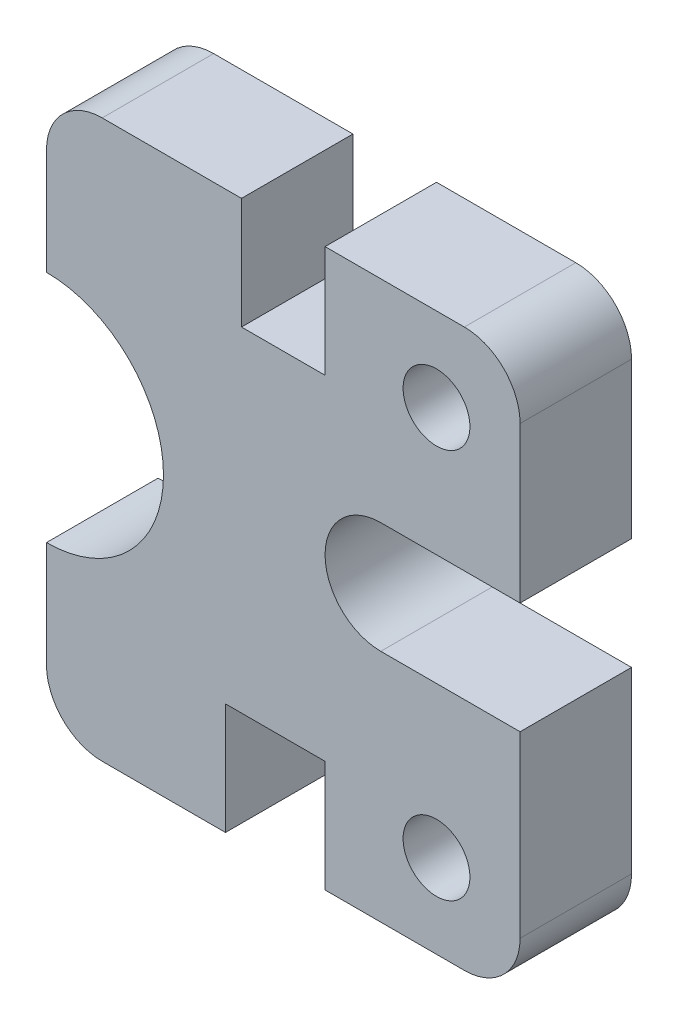
ISO-10303-21;
HEADER;
FILE_DESCRIPTION(('STEP AP214'),'2;1');
FILE_NAME('part.step','',(''),(''),'','','');
FILE_SCHEMA(('AUTOMOTIVE_DESIGN { 1 0 10303 214 1 1 1 1 }'));
ENDSEC;
DATA;
#1=APPLICATION_CONTEXT('core data for automotive mechanical design processes');
#2=APPLICATION_PROTOCOL_DEFINITION('international standard','automotive_design',2000,#1);
#3=PRODUCT_CONTEXT('',#1,'mechanical');
#4=PRODUCT('Part','Part','',(#3));
#5=PRODUCT_RELATED_PRODUCT_CATEGORY('part','',(#4));
#6=PRODUCT_DEFINITION_FORMATION('','',#4);
#7=PRODUCT_DEFINITION_CONTEXT('part definition',#1,'design');
#8=PRODUCT_DEFINITION('design','',#6,#7);
#9=PRODUCT_DEFINITION_SHAPE('','',#8);
#10=(LENGTH_UNIT() NAMED_UNIT(*) SI_UNIT(.MILLI.,.METRE.));
#11=(NAMED_UNIT(*) PLANE_ANGLE_UNIT() SI_UNIT($,.RADIAN.));
#12=(NAMED_UNIT(*) SI_UNIT($,.STERADIAN.) SOLID_ANGLE_UNIT());
#13=UNCERTAINTY_MEASURE_WITH_UNIT(LENGTH_MEASURE(1.E-05),#10,'distance_accuracy_value','');
#14=(GEOMETRIC_REPRESENTATION_CONTEXT(3) GLOBAL_UNCERTAINTY_ASSIGNED_CONTEXT((#13)) GLOBAL_UNIT_ASSIGNED_CONTEXT((#10,
#11,#12)) REPRESENTATION_CONTEXT('',''));
#15=CARTESIAN_POINT('',(0.,0.,0.));
#16=DIRECTION('',(0.,0.,1.));
#17=DIRECTION('',(1.,0.,0.));
#18=AXIS2_PLACEMENT_3D('',#15,#16,#17);
#19=CARTESIAN_POINT('',(32.5,40.,20.));
#20=DIRECTION('',(0.,0.,1.));
#21=DIRECTION('',(1.,0.,0.));
#22=AXIS2_PLACEMENT_3D('',#19,#20,#21);
#23=PLANE('',#22);
#24=CARTESIAN_POINT('',(27.5,35.,20.));
#25=DIRECTION('',(0.,0.,1.));
#26=DIRECTION('',(1.,0.,0.));
#27=AXIS2_PLACEMENT_3D('',#24,#25,#26);
#28=CIRCLE('',#27,6.);
#29=CARTESIAN_POINT('',(33.5,35.,20.));
#30=VERTEX_POINT('',#29);
#31=EDGE_CURVE('E218',#30,#30,#28,.T.);
#32=ORIENTED_EDGE('',*,*,#31,.F.);
#33=EDGE_LOOP('',(#32));
#34=FACE_BOUND('',#33,.T.);
#35=DIRECTION('',(-1.,0.,0.));
#36=VECTOR('',#35,1.);
#37=CARTESIAN_POINT('',(-32.4999999999999,50.,20.));
#38=LINE('',#37,#36);
#39=CARTESIAN_POINT('',(-7.5,50.,20.));
#40=VERTEX_POINT('',#39);
#41=CARTESIAN_POINT('',(-32.4999999999999,50.,20.));
#42=VERTEX_POINT('',#41);
#43=EDGE_CURVE('E257',#40,#42,#38,.T.);
#44=ORIENTED_EDGE('',*,*,#43,.T.);
#45=CARTESIAN_POINT('',(-32.5,40.,20.));
#46=DIRECTION('',(0.,0.,1.));
#47=DIRECTION('',(-1.,0.,0.));
#48=AXIS2_PLACEMENT_3D('',#45,#46,#47);
#49=CIRCLE('',#48,10.);
#50=CARTESIAN_POINT('',(-42.5,39.9999999999999,20.));
#51=VERTEX_POINT('',#50);
#52=EDGE_CURVE('E135',#42,#51,#49,.T.);
#53=ORIENTED_EDGE('',*,*,#52,.T.);
#54=DIRECTION('',(0.,-1.,0.));
#55=VECTOR('',#54,1.);
#56=CARTESIAN_POINT('',(-42.5,21.,20.));
#57=LINE('',#56,#55);
#58=CARTESIAN_POINT('',(-42.5,21.,20.));
#59=VERTEX_POINT('',#58);
#60=EDGE_CURVE('E314',#51,#59,#57,.T.);
#61=ORIENTED_EDGE('',*,*,#60,.T.);
#62=CARTESIAN_POINT('',(-42.5,0.,20.));
#63=DIRECTION('',(0.,0.,-1.));
#64=DIRECTION('',(1.,0.,0.));
#65=AXIS2_PLACEMENT_3D('',#62,#63,#64);
#66=CIRCLE('',#65,21.);
#67=CARTESIAN_POINT('',(-42.5,-21.,20.));
#68=VERTEX_POINT('',#67);
#69=EDGE_CURVE('E333',#59,#68,#66,.T.);
#70=ORIENTED_EDGE('',*,*,#69,.T.);
#71=DIRECTION('',(0.,-1.,0.));
#72=VECTOR('',#71,1.);
#73=CARTESIAN_POINT('',(-42.5,-39.9999999999999,20.));
#74=LINE('',#73,#72);
#75=CARTESIAN_POINT('',(-42.5,-40.,20.));
#76=VERTEX_POINT('',#75);
#77=EDGE_CURVE('E330',#68,#76,#74,.T.);
#78=ORIENTED_EDGE('',*,*,#77,.T.);
#79=CARTESIAN_POINT('',(-32.5,-40.,20.));
#80=DIRECTION('',(0.,0.,1.));
#81=DIRECTION('',(-1.,0.,0.));
#82=AXIS2_PLACEMENT_3D('',#79,#80,#81);
#83=CIRCLE('',#82,10.);
#84=CARTESIAN_POINT('',(-32.4999999999999,-50.,20.));
#85=VERTEX_POINT('',#84);
#86=EDGE_CURVE('E332',#76,#85,#83,.T.);
#87=ORIENTED_EDGE('',*,*,#86,.T.);
#88=DIRECTION('',(1.,0.,0.));
#89=VECTOR('',#88,1.);
#90=CARTESIAN_POINT('',(-32.4999999999999,-50.,20.));
#91=LINE('',#90,#89);
#92=CARTESIAN_POINT('',(-10.3726091663659,-50.,20.));
#93=VERTEX_POINT('',#92);
#94=EDGE_CURVE('E335',#85,#93,#91,.T.);
#95=ORIENTED_EDGE('',*,*,#94,.T.);
#96=DIRECTION('',(0.,1.,0.));
#97=VECTOR('',#96,1.);
#98=CARTESIAN_POINT('',(-10.3726091663659,-30.,20.));
#99=LINE('',#98,#97);
#100=CARTESIAN_POINT('',(-10.3726091663659,-30.,20.));
#101=VERTEX_POINT('',#100);
#102=EDGE_CURVE('E341',#93,#101,#99,.T.);
#103=ORIENTED_EDGE('',*,*,#102,.T.);
#104=DIRECTION('',(1.,0.,0.));
#105=VECTOR('',#104,1.);
#106=CARTESIAN_POINT('',(7.49999999999999,-30.,20.));
#107=LINE('',#106,#105);
#108=CARTESIAN_POINT('',(7.49999999999999,-30.,20.));
#109=VERTEX_POINT('',#108);
#110=EDGE_CURVE('E343',#101,#109,#107,.T.);
#111=ORIENTED_EDGE('',*,*,#110,.T.);
#112=DIRECTION('',(0.,-1.,0.));
#113=VECTOR('',#112,1.);
#114=CARTESIAN_POINT('',(7.5,-50.,20.));
#115=LINE('',#114,#113);
#116=CARTESIAN_POINT('',(7.5,-50.,20.));
#117=VERTEX_POINT('',#116);
#118=EDGE_CURVE('E345',#109,#117,#115,.T.);
#119=ORIENTED_EDGE('',*,*,#118,.T.);
#120=DIRECTION('',(1.,0.,0.));
#121=VECTOR('',#120,1.);
#122=CARTESIAN_POINT('',(7.5,-50.,20.));
#123=LINE('',#122,#121);
#124=CARTESIAN_POINT('',(32.4999999999999,-50.,20.));
#125=VERTEX_POINT('',#124);
#126=EDGE_CURVE('E347',#117,#125,#123,.T.);
#127=ORIENTED_EDGE('',*,*,#126,.T.);
#128=CARTESIAN_POINT('',(32.5,-40.,20.));
#129=DIRECTION('',(0.,0.,1.));
#130=DIRECTION('',(-1.,0.,0.));
#131=AXIS2_PLACEMENT_3D('',#128,#129,#130);
#132=CIRCLE('',#131,10.);
#133=CARTESIAN_POINT('',(42.5,-39.9999999999999,20.));
#134=VERTEX_POINT('',#133);
#135=EDGE_CURVE('E349',#125,#134,#132,.T.);
#136=ORIENTED_EDGE('',*,*,#135,.T.);
#137=DIRECTION('',(0.,1.,0.));
#138=VECTOR('',#137,1.);
#139=CARTESIAN_POINT('',(42.5,-39.9999999999999,20.));
#140=LINE('',#139,#138);
#141=CARTESIAN_POINT('',(42.5,-7.90215626127752,20.));
#142=VERTEX_POINT('',#141);
#143=EDGE_CURVE('E351',#134,#142,#140,.T.);
#144=ORIENTED_EDGE('',*,*,#143,.T.);
#145=DIRECTION('',(-1.,0.,0.));
#146=VECTOR('',#145,1.);
#147=CARTESIAN_POINT('',(17.5,-7.90215626127752,20.));
#148=LINE('',#147,#146);
#149=CARTESIAN_POINT('',(17.5,-7.90215626127752,20.));
#150=VERTEX_POINT('',#149);
#151=EDGE_CURVE('E353',#142,#150,#148,.T.);
#152=ORIENTED_EDGE('',*,*,#151,.T.);
#153=CARTESIAN_POINT('',(17.5,2.09784373872248,20.));
#154=DIRECTION('',(0.,0.,-1.));
#155=DIRECTION('',(1.,0.,0.));
#156=AXIS2_PLACEMENT_3D('',#153,#154,#155);
#157=CIRCLE('',#156,10.);
#158=CARTESIAN_POINT('',(17.5,12.0978437387225,20.));
#159=VERTEX_POINT('',#158);
#160=EDGE_CURVE('E355',#150,#159,#157,.T.);
#161=ORIENTED_EDGE('',*,*,#160,.T.);
#162=DIRECTION('',(1.,0.,0.));
#163=VECTOR('',#162,1.);
#164=CARTESIAN_POINT('',(42.5,12.0978437387225,20.));
#165=LINE('',#164,#163);
#166=CARTESIAN_POINT('',(42.5,12.0978437387225,20.));
#167=VERTEX_POINT('',#166);
#168=EDGE_CURVE('E357',#159,#167,#165,.T.);
#169=ORIENTED_EDGE('',*,*,#168,.T.);
#170=DIRECTION('',(0.,1.,0.));
#171=VECTOR('',#170,1.);
#172=CARTESIAN_POINT('',(42.5,12.0978437387225,20.));
#173=LINE('',#172,#171);
#174=CARTESIAN_POINT('',(42.5,39.9999999999999,20.));
#175=VERTEX_POINT('',#174);
#176=EDGE_CURVE('E359',#167,#175,#173,.T.);
#177=ORIENTED_EDGE('',*,*,#176,.T.);
#178=CARTESIAN_POINT('',(32.5,40.,20.));
#179=DIRECTION('',(0.,0.,1.));
#180=DIRECTION('',(1.,0.,0.));
#181=AXIS2_PLACEMENT_3D('',#178,#179,#180);
#182=CIRCLE('',#181,10.);
#183=CARTESIAN_POINT('',(32.4999999999999,50.,20.));
#184=VERTEX_POINT('',#183);
#185=EDGE_CURVE('E361',#175,#184,#182,.T.);
#186=ORIENTED_EDGE('',*,*,#185,.T.);
#187=DIRECTION('',(-1.,0.,0.));
#188=VECTOR('',#187,1.);
#189=CARTESIAN_POINT('',(7.5,50.,20.));
#190=LINE('',#189,#188);
#191=CARTESIAN_POINT('',(7.5,50.,20.));
#192=VERTEX_POINT('',#191);
#193=EDGE_CURVE('E196',#184,#192,#190,.T.);
#194=ORIENTED_EDGE('',*,*,#193,.T.);
#195=DIRECTION('',(0.,-1.,0.));
#196=VECTOR('',#195,1.);
#197=CARTESIAN_POINT('',(7.49999999999999,30.,20.));
#198=LINE('',#197,#196);
#199=CARTESIAN_POINT('',(7.49999999999999,30.,20.));
#200=VERTEX_POINT('',#199);
#201=EDGE_CURVE('E190',#192,#200,#198,.T.);
#202=ORIENTED_EDGE('',*,*,#201,.T.);
#203=DIRECTION('',(-1.,0.,0.));
#204=VECTOR('',#203,1.);
#205=CARTESIAN_POINT('',(-7.50000000000001,30.,20.));
#206=LINE('',#205,#204);
#207=CARTESIAN_POINT('',(-7.50000000000001,30.,20.));
#208=VERTEX_POINT('',#207);
#209=EDGE_CURVE('E194',#200,#208,#206,.T.);
#210=ORIENTED_EDGE('',*,*,#209,.T.);
#211=DIRECTION('',(0.,1.,0.));
#212=VECTOR('',#211,1.);
#213=CARTESIAN_POINT('',(-7.5,50.,20.));
#214=LINE('',#213,#212);
#215=EDGE_CURVE('E50',#208,#40,#214,.T.);
#216=ORIENTED_EDGE('',*,*,#215,.T.);
#217=EDGE_LOOP('',(#44,#53,#61,#70,#78,#87,#95,#103,#111,#119,#127,#136,#144,#152,#161,#169,
#177,#186,#194,#202,#210,#216));
#218=FACE_BOUND('',#217,.T.);
#219=CARTESIAN_POINT('',(27.5,-35.,20.));
#220=DIRECTION('',(0.,0.,1.));
#221=DIRECTION('',(1.,0.,0.));
#222=AXIS2_PLACEMENT_3D('',#219,#220,#221);
#223=CIRCLE('',#222,5.99999999999999);
#224=CARTESIAN_POINT('',(33.5,-35.,20.));
#225=VERTEX_POINT('',#224);
#226=EDGE_CURVE('E403',#225,#225,#223,.T.);
#227=ORIENTED_EDGE('',*,*,#226,.F.);
#228=EDGE_LOOP('',(#227));
#229=FACE_BOUND('',#228,.T.);
#230=ADVANCED_FACE('F33',(#34,#218,#229),#23,.T.);
#231=CARTESIAN_POINT('',(32.5,40.,0.));
#232=DIRECTION('',(0.,0.,1.));
#233=DIRECTION('',(1.,0.,0.));
#234=AXIS2_PLACEMENT_3D('',#231,#232,#233);
#235=PLANE('',#234);
#236=DIRECTION('',(-1.,0.,0.));
#237=VECTOR('',#236,1.);
#238=CARTESIAN_POINT('',(-32.4999999999999,50.,0.));
#239=LINE('',#238,#237);
#240=CARTESIAN_POINT('',(-7.5,50.,0.));
#241=VERTEX_POINT('',#240);
#242=CARTESIAN_POINT('',(-32.4999999999999,50.,0.));
#243=VERTEX_POINT('',#242);
#244=EDGE_CURVE('E214',#241,#243,#239,.T.);
#245=ORIENTED_EDGE('',*,*,#244,.F.);
#246=DIRECTION('',(0.,1.,0.));
#247=VECTOR('',#246,1.);
#248=CARTESIAN_POINT('',(-7.5,50.,0.));
#249=LINE('',#248,#247);
#250=CARTESIAN_POINT('',(-7.50000000000001,30.,0.));
#251=VERTEX_POINT('',#250);
#252=EDGE_CURVE('E127',#251,#241,#249,.T.);
#253=ORIENTED_EDGE('',*,*,#252,.F.);
#254=DIRECTION('',(-1.,0.,0.));
#255=VECTOR('',#254,1.);
#256=CARTESIAN_POINT('',(-7.50000000000001,30.,0.));
#257=LINE('',#256,#255);
#258=CARTESIAN_POINT('',(7.49999999999999,30.,0.));
#259=VERTEX_POINT('',#258);
#260=EDGE_CURVE('E121',#259,#251,#257,.T.);
#261=ORIENTED_EDGE('',*,*,#260,.F.);
#262=DIRECTION('',(0.,-1.,0.));
#263=VECTOR('',#262,1.);
#264=CARTESIAN_POINT('',(7.49999999999999,30.,0.));
#265=LINE('',#264,#263);
#266=CARTESIAN_POINT('',(7.5,50.,0.));
#267=VERTEX_POINT('',#266);
#268=EDGE_CURVE('E204',#267,#259,#265,.T.);
#269=ORIENTED_EDGE('',*,*,#268,.F.);
#270=DIRECTION('',(-1.,0.,0.));
#271=VECTOR('',#270,1.);
#272=CARTESIAN_POINT('',(7.5,50.,0.));
#273=LINE('',#272,#271);
#274=CARTESIAN_POINT('',(32.4999999999999,50.,0.));
#275=VERTEX_POINT('',#274);
#276=EDGE_CURVE('E252',#275,#267,#273,.T.);
#277=ORIENTED_EDGE('',*,*,#276,.F.);
#278=CARTESIAN_POINT('',(32.5,40.,0.));
#279=DIRECTION('',(0.,0.,1.));
#280=DIRECTION('',(1.,0.,0.));
#281=AXIS2_PLACEMENT_3D('',#278,#279,#280);
#282=CIRCLE('',#281,10.);
#283=CARTESIAN_POINT('',(42.5,39.9999999999999,0.));
#284=VERTEX_POINT('',#283);
#285=EDGE_CURVE('E250',#284,#275,#282,.T.);
#286=ORIENTED_EDGE('',*,*,#285,.F.);
#287=DIRECTION('',(0.,1.,0.));
#288=VECTOR('',#287,1.);
#289=CARTESIAN_POINT('',(42.5,12.0978437387225,0.));
#290=LINE('',#289,#288);
#291=CARTESIAN_POINT('',(42.5,12.0978437387225,0.));
#292=VERTEX_POINT('',#291);
#293=EDGE_CURVE('E248',#292,#284,#290,.T.);
#294=ORIENTED_EDGE('',*,*,#293,.F.);
#295=DIRECTION('',(1.,0.,0.));
#296=VECTOR('',#295,1.);
#297=CARTESIAN_POINT('',(42.5,12.0978437387225,0.));
#298=LINE('',#297,#296);
#299=CARTESIAN_POINT('',(17.5,12.0978437387225,0.));
#300=VERTEX_POINT('',#299);
#301=EDGE_CURVE('E246',#300,#292,#298,.T.);
#302=ORIENTED_EDGE('',*,*,#301,.F.);
#303=CARTESIAN_POINT('',(17.5,2.09784373872248,0.));
#304=DIRECTION('',(0.,0.,-1.));
#305=DIRECTION('',(1.,0.,0.));
#306=AXIS2_PLACEMENT_3D('',#303,#304,#305);
#307=CIRCLE('',#306,10.);
#308=CARTESIAN_POINT('',(17.5,-7.90215626127752,0.));
#309=VERTEX_POINT('',#308);
#310=EDGE_CURVE('E244',#309,#300,#307,.T.);
#311=ORIENTED_EDGE('',*,*,#310,.F.);
#312=DIRECTION('',(-1.,0.,0.));
#313=VECTOR('',#312,1.);
#314=CARTESIAN_POINT('',(17.5,-7.90215626127752,0.));
#315=LINE('',#314,#313);
#316=CARTESIAN_POINT('',(42.5,-7.90215626127752,0.));
#317=VERTEX_POINT('',#316);
#318=EDGE_CURVE('E242',#317,#309,#315,.T.);
#319=ORIENTED_EDGE('',*,*,#318,.F.);
#320=DIRECTION('',(0.,1.,0.));
#321=VECTOR('',#320,1.);
#322=CARTESIAN_POINT('',(42.5,-39.9999999999999,0.));
#323=LINE('',#322,#321);
#324=CARTESIAN_POINT('',(42.5,-39.9999999999999,0.));
#325=VERTEX_POINT('',#324);
#326=EDGE_CURVE('E240',#325,#317,#323,.T.);
#327=ORIENTED_EDGE('',*,*,#326,.F.);
#328=CARTESIAN_POINT('',(32.5,-40.,0.));
#329=DIRECTION('',(0.,0.,1.));
#330=DIRECTION('',(-1.,0.,0.));
#331=AXIS2_PLACEMENT_3D('',#328,#329,#330);
#332=CIRCLE('',#331,10.);
#333=CARTESIAN_POINT('',(32.4999999999999,-50.,0.));
#334=VERTEX_POINT('',#333);
#335=EDGE_CURVE('E238',#334,#325,#332,.T.);
#336=ORIENTED_EDGE('',*,*,#335,.F.);
#337=DIRECTION('',(1.,0.,0.));
#338=VECTOR('',#337,1.);
#339=CARTESIAN_POINT('',(7.5,-50.,0.));
#340=LINE('',#339,#338);
#341=CARTESIAN_POINT('',(7.5,-50.,0.));
#342=VERTEX_POINT('',#341);
#343=EDGE_CURVE('E236',#342,#334,#340,.T.);
#344=ORIENTED_EDGE('',*,*,#343,.F.);
#345=DIRECTION('',(0.,-1.,0.));
#346=VECTOR('',#345,1.);
#347=CARTESIAN_POINT('',(7.5,-50.,0.));
#348=LINE('',#347,#346);
#349=CARTESIAN_POINT('',(7.49999999999999,-30.,0.));
#350=VERTEX_POINT('',#349);
#351=EDGE_CURVE('E234',#350,#342,#348,.T.);
#352=ORIENTED_EDGE('',*,*,#351,.F.);
#353=DIRECTION('',(1.,0.,0.));
#354=VECTOR('',#353,1.);
#355=CARTESIAN_POINT('',(7.49999999999999,-30.,0.));
#356=LINE('',#355,#354);
#357=CARTESIAN_POINT('',(-10.3726091663659,-30.,0.));
#358=VERTEX_POINT('',#357);
#359=EDGE_CURVE('E232',#358,#350,#356,.T.);
#360=ORIENTED_EDGE('',*,*,#359,.F.);
#361=DIRECTION('',(0.,1.,0.));
#362=VECTOR('',#361,1.);
#363=CARTESIAN_POINT('',(-10.3726091663659,-30.,0.));
#364=LINE('',#363,#362);
#365=CARTESIAN_POINT('',(-10.3726091663659,-50.,0.));
#366=VERTEX_POINT('',#365);
#367=EDGE_CURVE('E230',#366,#358,#364,.T.);
#368=ORIENTED_EDGE('',*,*,#367,.F.);
#369=DIRECTION('',(1.,0.,0.));
#370=VECTOR('',#369,1.);
#371=CARTESIAN_POINT('',(-32.4999999999999,-50.,0.));
#372=LINE('',#371,#370);
#373=CARTESIAN_POINT('',(-32.4999999999999,-50.,0.));
#374=VERTEX_POINT('',#373);
#375=EDGE_CURVE('E228',#374,#366,#372,.T.);
#376=ORIENTED_EDGE('',*,*,#375,.F.);
#377=CARTESIAN_POINT('',(-32.5,-40.,0.));
#378=DIRECTION('',(0.,0.,1.));
#379=DIRECTION('',(-1.,0.,0.));
#380=AXIS2_PLACEMENT_3D('',#377,#378,#379);
#381=CIRCLE('',#380,10.);
#382=CARTESIAN_POINT('',(-42.5,-40.,0.));
#383=VERTEX_POINT('',#382);
#384=EDGE_CURVE('E226',#383,#374,#381,.T.);
#385=ORIENTED_EDGE('',*,*,#384,.F.);
#386=DIRECTION('',(0.,-1.,0.));
#387=VECTOR('',#386,1.);
#388=CARTESIAN_POINT('',(-42.5,-39.9999999999999,0.));
#389=LINE('',#388,#387);
#390=CARTESIAN_POINT('',(-42.5,-21.,0.));
#391=VERTEX_POINT('',#390);
#392=EDGE_CURVE('E224',#391,#383,#389,.T.);
#393=ORIENTED_EDGE('',*,*,#392,.F.);
#394=CARTESIAN_POINT('',(-42.5,0.,0.));
#395=DIRECTION('',(0.,0.,-1.));
#396=DIRECTION('',(1.,0.,0.));
#397=AXIS2_PLACEMENT_3D('',#394,#395,#396);
#398=CIRCLE('',#397,21.);
#399=CARTESIAN_POINT('',(-42.5,21.,0.));
#400=VERTEX_POINT('',#399);
#401=EDGE_CURVE('E222',#400,#391,#398,.T.);
#402=ORIENTED_EDGE('',*,*,#401,.F.);
#403=DIRECTION('',(0.,-1.,0.));
#404=VECTOR('',#403,1.);
#405=CARTESIAN_POINT('',(-42.5,21.,0.));
#406=LINE('',#405,#404);
#407=CARTESIAN_POINT('',(-42.5,39.9999999999999,0.));
#408=VERTEX_POINT('',#407);
#409=EDGE_CURVE('E220',#408,#400,#406,.T.);
#410=ORIENTED_EDGE('',*,*,#409,.F.);
#411=CARTESIAN_POINT('',(-32.5,40.,0.));
#412=DIRECTION('',(0.,0.,1.));
#413=DIRECTION('',(-1.,0.,0.));
#414=AXIS2_PLACEMENT_3D('',#411,#412,#413);
#415=CIRCLE('',#414,10.);
#416=EDGE_CURVE('E217',#243,#408,#415,.T.);
#417=ORIENTED_EDGE('',*,*,#416,.F.);
#418=EDGE_LOOP('',(#245,#253,#261,#269,#277,#286,#294,#302,#311,#319,#327,#336,#344,#352,#360,
#368,#376,#385,#393,#402,#410,#417));
#419=FACE_BOUND('',#418,.T.);
#420=CARTESIAN_POINT('',(27.5,35.,0.));
#421=DIRECTION('',(0.,0.,1.));
#422=DIRECTION('',(1.,0.,0.));
#423=AXIS2_PLACEMENT_3D('',#420,#421,#422);
#424=CIRCLE('',#423,6.);
#425=CARTESIAN_POINT('',(33.5,35.,0.));
#426=VERTEX_POINT('',#425);
#427=EDGE_CURVE('E409',#426,#426,#424,.T.);
#428=ORIENTED_EDGE('',*,*,#427,.T.);
#429=EDGE_LOOP('',(#428));
#430=FACE_BOUND('',#429,.T.);
#431=CARTESIAN_POINT('',(27.5,-35.,0.));
#432=DIRECTION('',(0.,0.,1.));
#433=DIRECTION('',(1.,0.,0.));
#434=AXIS2_PLACEMENT_3D('',#431,#432,#433);
#435=CIRCLE('',#434,5.99999999999999);
#436=CARTESIAN_POINT('',(33.5,-35.,0.));
#437=VERTEX_POINT('',#436);
#438=EDGE_CURVE('E406',#437,#437,#435,.T.);
#439=ORIENTED_EDGE('',*,*,#438,.T.);
#440=EDGE_LOOP('',(#439));
#441=FACE_BOUND('',#440,.T.);
#442=ADVANCED_FACE('F318',(#419,#430,#441),#235,.F.);
#443=CARTESIAN_POINT('',(-32.4999999999999,50.,20.));
#444=DIRECTION('',(0.,-1.,0.));
#445=DIRECTION('',(1.,0.,0.));
#446=AXIS2_PLACEMENT_3D('',#443,#444,#445);
#447=PLANE('',#446);
#448=ORIENTED_EDGE('',*,*,#244,.T.);
#449=DIRECTION('',(0.,0.,-1.));
#450=VECTOR('',#449,1.);
#451=CARTESIAN_POINT('',(-32.4999999999999,50.,20.));
#452=LINE('',#451,#450);
#453=EDGE_CURVE('E11',#42,#243,#452,.T.);
#454=ORIENTED_EDGE('',*,*,#453,.F.);
#455=ORIENTED_EDGE('',*,*,#43,.F.);
#456=DIRECTION('',(0.,0.,-1.));
#457=VECTOR('',#456,1.);
#458=CARTESIAN_POINT('',(-7.5,50.,20.));
#459=LINE('',#458,#457);
#460=EDGE_CURVE('E210',#40,#241,#459,.T.);
#461=ORIENTED_EDGE('',*,*,#460,.T.);
#462=EDGE_LOOP('',(#448,#454,#455,#461));
#463=FACE_BOUND('',#462,.T.);
#464=ADVANCED_FACE('F35',(#463),#447,.F.);
#465=CARTESIAN_POINT('',(-32.5,40.,20.));
#466=DIRECTION('',(0.,0.,-1.));
#467=DIRECTION('',(-1.,0.,0.));
#468=AXIS2_PLACEMENT_3D('',#465,#466,#467);
#469=CYLINDRICAL_SURFACE('',#468,10.);
#470=ORIENTED_EDGE('',*,*,#416,.T.);
#471=DIRECTION('',(0.,0.,-1.));
#472=VECTOR('',#471,1.);
#473=CARTESIAN_POINT('',(-42.5,39.9999999999999,20.));
#474=LINE('',#473,#472);
#475=EDGE_CURVE('E42',#51,#408,#474,.T.);
#476=ORIENTED_EDGE('',*,*,#475,.F.);
#477=ORIENTED_EDGE('',*,*,#52,.F.);
#478=ORIENTED_EDGE('',*,*,#453,.T.);
#479=EDGE_LOOP('',(#470,#476,#477,#478));
#480=FACE_BOUND('',#479,.T.);
#481=ADVANCED_FACE('F602',(#480),#469,.T.);
#482=CARTESIAN_POINT('',(-42.5,21.,20.));
#483=DIRECTION('',(1.,0.,0.));
#484=DIRECTION('',(0.,0.,-1.));
#485=AXIS2_PLACEMENT_3D('',#482,#483,#484);
#486=PLANE('',#485);
#487=ORIENTED_EDGE('',*,*,#409,.T.);
#488=DIRECTION('',(0.,0.,-1.));
#489=VECTOR('',#488,1.);
#490=CARTESIAN_POINT('',(-42.5,21.,20.));
#491=LINE('',#490,#489);
#492=EDGE_CURVE('E306',#59,#400,#491,.T.);
#493=ORIENTED_EDGE('',*,*,#492,.F.);
#494=ORIENTED_EDGE('',*,*,#60,.F.);
#495=ORIENTED_EDGE('',*,*,#475,.T.);
#496=EDGE_LOOP('',(#487,#493,#494,#495));
#497=FACE_BOUND('',#496,.T.);
#498=ADVANCED_FACE('F312',(#497),#486,.F.);
#499=CARTESIAN_POINT('',(-42.5,0.,20.));
#500=DIRECTION('',(0.,0.,-1.));
#501=DIRECTION('',(-1.,0.,0.));
#502=AXIS2_PLACEMENT_3D('',#499,#500,#501);
#503=CYLINDRICAL_SURFACE('',#502,21.);
#504=ORIENTED_EDGE('',*,*,#401,.T.);
#505=DIRECTION('',(0.,0.,-1.));
#506=VECTOR('',#505,1.);
#507=CARTESIAN_POINT('',(-42.5,-21.,20.));
#508=LINE('',#507,#506);
#509=EDGE_CURVE('E303',#68,#391,#508,.T.);
#510=ORIENTED_EDGE('',*,*,#509,.F.);
#511=ORIENTED_EDGE('',*,*,#69,.F.);
#512=ORIENTED_EDGE('',*,*,#492,.T.);
#513=EDGE_LOOP('',(#504,#510,#511,#512));
#514=FACE_BOUND('',#513,.T.);
#515=ADVANCED_FACE('F324',(#514),#503,.F.);
#516=CARTESIAN_POINT('',(-42.5,-39.9999999999999,20.));
#517=DIRECTION('',(1.,0.,0.));
#518=DIRECTION('',(0.,0.,-1.));
#519=AXIS2_PLACEMENT_3D('',#516,#517,#518);
#520=PLANE('',#519);
#521=ORIENTED_EDGE('',*,*,#392,.T.);
#522=DIRECTION('',(0.,0.,-1.));
#523=VECTOR('',#522,1.);
#524=CARTESIAN_POINT('',(-42.5,-40.,20.));
#525=LINE('',#524,#523);
#526=EDGE_CURVE('E300',#76,#383,#525,.T.);
#527=ORIENTED_EDGE('',*,*,#526,.F.);
#528=ORIENTED_EDGE('',*,*,#77,.F.);
#529=ORIENTED_EDGE('',*,*,#509,.T.);
#530=EDGE_LOOP('',(#521,#527,#528,#529));
#531=FACE_BOUND('',#530,.T.);
#532=ADVANCED_FACE('F328',(#531),#520,.F.);
#533=CARTESIAN_POINT('',(-32.5,-40.,20.));
#534=DIRECTION('',(0.,0.,-1.));
#535=DIRECTION('',(-1.,0.,0.));
#536=AXIS2_PLACEMENT_3D('',#533,#534,#535);
#537=CYLINDRICAL_SURFACE('',#536,10.);
#538=ORIENTED_EDGE('',*,*,#384,.T.);
#539=DIRECTION('',(0.,0.,-1.));
#540=VECTOR('',#539,1.);
#541=CARTESIAN_POINT('',(-32.4999999999999,-50.,20.));
#542=LINE('',#541,#540);
#543=EDGE_CURVE('E297',#85,#374,#542,.T.);
#544=ORIENTED_EDGE('',*,*,#543,.F.);
#545=ORIENTED_EDGE('',*,*,#86,.F.);
#546=ORIENTED_EDGE('',*,*,#526,.T.);
#547=EDGE_LOOP('',(#538,#544,#545,#546));
#548=FACE_BOUND('',#547,.T.);
#549=ADVANCED_FACE('F567',(#548),#537,.T.);
#550=CARTESIAN_POINT('',(-32.4999999999999,-50.,20.));
#551=DIRECTION('',(0.,1.,0.));
#552=DIRECTION('',(0.,0.,1.));
#553=AXIS2_PLACEMENT_3D('',#550,#551,#552);
#554=PLANE('',#553);
#555=ORIENTED_EDGE('',*,*,#375,.T.);
#556=DIRECTION('',(0.,0.,-1.));
#557=VECTOR('',#556,1.);
#558=CARTESIAN_POINT('',(-10.3726091663659,-50.,20.));
#559=LINE('',#558,#557);
#560=EDGE_CURVE('E294',#93,#366,#559,.T.);
#561=ORIENTED_EDGE('',*,*,#560,.F.);
#562=ORIENTED_EDGE('',*,*,#94,.F.);
#563=ORIENTED_EDGE('',*,*,#543,.T.);
#564=EDGE_LOOP('',(#555,#561,#562,#563));
#565=FACE_BOUND('',#564,.T.);
#566=ADVANCED_FACE('F557',(#565),#554,.F.);
#567=CARTESIAN_POINT('',(-10.3726091663659,-30.,20.));
#568=DIRECTION('',(-1.,0.,0.));
#569=DIRECTION('',(0.,-1.,0.));
#570=AXIS2_PLACEMENT_3D('',#567,#568,#569);
#571=PLANE('',#570);
#572=ORIENTED_EDGE('',*,*,#367,.T.);
#573=DIRECTION('',(0.,0.,-1.));
#574=VECTOR('',#573,1.);
#575=CARTESIAN_POINT('',(-10.3726091663659,-30.,20.));
#576=LINE('',#575,#574);
#577=EDGE_CURVE('E291',#101,#358,#576,.T.);
#578=ORIENTED_EDGE('',*,*,#577,.F.);
#579=ORIENTED_EDGE('',*,*,#102,.F.);
#580=ORIENTED_EDGE('',*,*,#560,.T.);
#581=EDGE_LOOP('',(#572,#578,#579,#580));
#582=FACE_BOUND('',#581,.T.);
#583=ADVANCED_FACE('F547',(#582),#571,.F.);
#584=CARTESIAN_POINT('',(7.49999999999999,-30.,20.));
#585=DIRECTION('',(0.,1.,0.));
#586=DIRECTION('',(0.,0.,1.));
#587=AXIS2_PLACEMENT_3D('',#584,#585,#586);
#588=PLANE('',#587);
#589=ORIENTED_EDGE('',*,*,#359,.T.);
#590=DIRECTION('',(0.,0.,-1.));
#591=VECTOR('',#590,1.);
#592=CARTESIAN_POINT('',(7.49999999999999,-30.,20.));
#593=LINE('',#592,#591);
#594=EDGE_CURVE('E288',#109,#350,#593,.T.);
#595=ORIENTED_EDGE('',*,*,#594,.F.);
#596=ORIENTED_EDGE('',*,*,#110,.F.);
#597=ORIENTED_EDGE('',*,*,#577,.T.);
#598=EDGE_LOOP('',(#589,#595,#596,#597));
#599=FACE_BOUND('',#598,.T.);
#600=ADVANCED_FACE('F537',(#599),#588,.F.);
#601=CARTESIAN_POINT('',(7.5,-50.,20.));
#602=DIRECTION('',(1.,0.,0.));
#603=DIRECTION('',(0.,1.,0.));
#604=AXIS2_PLACEMENT_3D('',#601,#602,#603);
#605=PLANE('',#604);
#606=ORIENTED_EDGE('',*,*,#351,.T.);
#607=DIRECTION('',(0.,0.,-1.));
#608=VECTOR('',#607,1.);
#609=CARTESIAN_POINT('',(7.5,-50.,20.));
#610=LINE('',#609,#608);
#611=EDGE_CURVE('E285',#117,#342,#610,.T.);
#612=ORIENTED_EDGE('',*,*,#611,.F.);
#613=ORIENTED_EDGE('',*,*,#118,.F.);
#614=ORIENTED_EDGE('',*,*,#594,.T.);
#615=EDGE_LOOP('',(#606,#612,#613,#614));
#616=FACE_BOUND('',#615,.T.);
#617=ADVANCED_FACE('F527',(#616),#605,.F.);
#618=CARTESIAN_POINT('',(7.5,-50.,20.));
#619=DIRECTION('',(0.,1.,0.));
#620=DIRECTION('',(0.,0.,1.));
#621=AXIS2_PLACEMENT_3D('',#618,#619,#620);
#622=PLANE('',#621);
#623=ORIENTED_EDGE('',*,*,#343,.T.);
#624=DIRECTION('',(0.,0.,-1.));
#625=VECTOR('',#624,1.);
#626=CARTESIAN_POINT('',(32.4999999999999,-50.,20.));
#627=LINE('',#626,#625);
#628=EDGE_CURVE('E282',#125,#334,#627,.T.);
#629=ORIENTED_EDGE('',*,*,#628,.F.);
#630=ORIENTED_EDGE('',*,*,#126,.F.);
#631=ORIENTED_EDGE('',*,*,#611,.T.);
#632=EDGE_LOOP('',(#623,#629,#630,#631));
#633=FACE_BOUND('',#632,.T.);
#634=ADVANCED_FACE('F517',(#633),#622,.F.);
#635=CARTESIAN_POINT('',(32.5,-40.,20.));
#636=DIRECTION('',(0.,0.,-1.));
#637=DIRECTION('',(-1.,0.,0.));
#638=AXIS2_PLACEMENT_3D('',#635,#636,#637);
#639=CYLINDRICAL_SURFACE('',#638,10.);
#640=ORIENTED_EDGE('',*,*,#335,.T.);
#641=DIRECTION('',(0.,0.,-1.));
#642=VECTOR('',#641,1.);
#643=CARTESIAN_POINT('',(42.5,-39.9999999999999,20.));
#644=LINE('',#643,#642);
#645=EDGE_CURVE('E279',#134,#325,#644,.T.);
#646=ORIENTED_EDGE('',*,*,#645,.F.);
#647=ORIENTED_EDGE('',*,*,#135,.F.);
#648=ORIENTED_EDGE('',*,*,#628,.T.);
#649=EDGE_LOOP('',(#640,#646,#647,#648));
#650=FACE_BOUND('',#649,.T.);
#651=ADVANCED_FACE('F507',(#650),#639,.T.);
#652=CARTESIAN_POINT('',(42.5,-39.9999999999999,20.));
#653=DIRECTION('',(-1.,0.,0.));
#654=DIRECTION('',(0.,0.,1.));
#655=AXIS2_PLACEMENT_3D('',#652,#653,#654);
#656=PLANE('',#655);
#657=ORIENTED_EDGE('',*,*,#326,.T.);
#658=DIRECTION('',(0.,0.,-1.));
#659=VECTOR('',#658,1.);
#660=CARTESIAN_POINT('',(42.5,-7.90215626127752,20.));
#661=LINE('',#660,#659);
#662=EDGE_CURVE('E276',#142,#317,#661,.T.);
#663=ORIENTED_EDGE('',*,*,#662,.F.);
#664=ORIENTED_EDGE('',*,*,#143,.F.);
#665=ORIENTED_EDGE('',*,*,#645,.T.);
#666=EDGE_LOOP('',(#657,#663,#664,#665));
#667=FACE_BOUND('',#666,.T.);
#668=ADVANCED_FACE('F497',(#667),#656,.F.);
#669=CARTESIAN_POINT('',(17.5,-7.90215626127752,20.));
#670=DIRECTION('',(0.,-1.,0.));
#671=DIRECTION('',(0.,0.,-1.));
#672=AXIS2_PLACEMENT_3D('',#669,#670,#671);
#673=PLANE('',#672);
#674=ORIENTED_EDGE('',*,*,#318,.T.);
#675=DIRECTION('',(0.,0.,-1.));
#676=VECTOR('',#675,1.);
#677=CARTESIAN_POINT('',(17.5,-7.90215626127752,20.));
#678=LINE('',#677,#676);
#679=EDGE_CURVE('E273',#150,#309,#678,.T.);
#680=ORIENTED_EDGE('',*,*,#679,.F.);
#681=ORIENTED_EDGE('',*,*,#151,.F.);
#682=ORIENTED_EDGE('',*,*,#662,.T.);
#683=EDGE_LOOP('',(#674,#680,#681,#682));
#684=FACE_BOUND('',#683,.T.);
#685=ADVANCED_FACE('F487',(#684),#673,.F.);
#686=CARTESIAN_POINT('',(17.5,2.09784373872248,20.));
#687=DIRECTION('',(0.,0.,-1.));
#688=DIRECTION('',(-1.,0.,0.));
#689=AXIS2_PLACEMENT_3D('',#686,#687,#688);
#690=CYLINDRICAL_SURFACE('',#689,10.);
#691=ORIENTED_EDGE('',*,*,#310,.T.);
#692=DIRECTION('',(0.,0.,-1.));
#693=VECTOR('',#692,1.);
#694=CARTESIAN_POINT('',(17.5,12.0978437387225,20.));
#695=LINE('',#694,#693);
#696=EDGE_CURVE('E270',#159,#300,#695,.T.);
#697=ORIENTED_EDGE('',*,*,#696,.F.);
#698=ORIENTED_EDGE('',*,*,#160,.F.);
#699=ORIENTED_EDGE('',*,*,#679,.T.);
#700=EDGE_LOOP('',(#691,#697,#698,#699));
#701=FACE_BOUND('',#700,.T.);
#702=ADVANCED_FACE('F477',(#701),#690,.F.);
#703=CARTESIAN_POINT('',(42.5,12.0978437387225,20.));
#704=DIRECTION('',(0.,1.,0.));
#705=DIRECTION('',(-1.,0.,0.));
#706=AXIS2_PLACEMENT_3D('',#703,#704,#705);
#707=PLANE('',#706);
#708=ORIENTED_EDGE('',*,*,#301,.T.);
#709=DIRECTION('',(0.,0.,-1.));
#710=VECTOR('',#709,1.);
#711=CARTESIAN_POINT('',(42.5,12.0978437387225,20.));
#712=LINE('',#711,#710);
#713=EDGE_CURVE('E267',#167,#292,#712,.T.);
#714=ORIENTED_EDGE('',*,*,#713,.F.);
#715=ORIENTED_EDGE('',*,*,#168,.F.);
#716=ORIENTED_EDGE('',*,*,#696,.T.);
#717=EDGE_LOOP('',(#708,#714,#715,#716));
#718=FACE_BOUND('',#717,.T.);
#719=ADVANCED_FACE('F467',(#718),#707,.F.);
#720=CARTESIAN_POINT('',(42.5,12.0978437387225,20.));
#721=DIRECTION('',(-1.,0.,0.));
#722=DIRECTION('',(0.,-1.,0.));
#723=AXIS2_PLACEMENT_3D('',#720,#721,#722);
#724=PLANE('',#723);
#725=ORIENTED_EDGE('',*,*,#293,.T.);
#726=DIRECTION('',(0.,0.,-1.));
#727=VECTOR('',#726,1.);
#728=CARTESIAN_POINT('',(42.5,39.9999999999999,20.));
#729=LINE('',#728,#727);
#730=EDGE_CURVE('E264',#175,#284,#729,.T.);
#731=ORIENTED_EDGE('',*,*,#730,.F.);
#732=ORIENTED_EDGE('',*,*,#176,.F.);
#733=ORIENTED_EDGE('',*,*,#713,.T.);
#734=EDGE_LOOP('',(#725,#731,#732,#733));
#735=FACE_BOUND('',#734,.T.);
#736=ADVANCED_FACE('F458',(#735),#724,.F.);
#737=CARTESIAN_POINT('',(32.5,40.,20.));
#738=DIRECTION('',(0.,0.,-1.));
#739=DIRECTION('',(-1.,0.,0.));
#740=AXIS2_PLACEMENT_3D('',#737,#738,#739);
#741=CYLINDRICAL_SURFACE('',#740,10.);
#742=ORIENTED_EDGE('',*,*,#285,.T.);
#743=DIRECTION('',(0.,0.,-1.));
#744=VECTOR('',#743,1.);
#745=CARTESIAN_POINT('',(32.4999999999999,50.,20.));
#746=LINE('',#745,#744);
#747=EDGE_CURVE('E261',#184,#275,#746,.T.);
#748=ORIENTED_EDGE('',*,*,#747,.F.);
#749=ORIENTED_EDGE('',*,*,#185,.F.);
#750=ORIENTED_EDGE('',*,*,#730,.T.);
#751=EDGE_LOOP('',(#742,#748,#749,#750));
#752=FACE_BOUND('',#751,.T.);
#753=ADVANCED_FACE('F367',(#752),#741,.T.);
#754=CARTESIAN_POINT('',(7.5,50.,20.));
#755=DIRECTION('',(0.,-1.,0.));
#756=DIRECTION('',(1.,0.,0.));
#757=AXIS2_PLACEMENT_3D('',#754,#755,#756);
#758=PLANE('',#757);
#759=ORIENTED_EDGE('',*,*,#276,.T.);
#760=DIRECTION('',(0.,0.,-1.));
#761=VECTOR('',#760,1.);
#762=CARTESIAN_POINT('',(7.5,50.,20.));
#763=LINE('',#762,#761);
#764=EDGE_CURVE('E205',#192,#267,#763,.T.);
#765=ORIENTED_EDGE('',*,*,#764,.F.);
#766=ORIENTED_EDGE('',*,*,#193,.F.);
#767=ORIENTED_EDGE('',*,*,#747,.T.);
#768=EDGE_LOOP('',(#759,#765,#766,#767));
#769=FACE_BOUND('',#768,.T.);
#770=ADVANCED_FACE('F371',(#769),#758,.F.);
#771=CARTESIAN_POINT('',(7.49999999999999,30.,20.));
#772=DIRECTION('',(1.,0.,0.));
#773=DIRECTION('',(0.,1.,0.));
#774=AXIS2_PLACEMENT_3D('',#771,#772,#773);
#775=PLANE('',#774);
#776=ORIENTED_EDGE('',*,*,#268,.T.);
#777=DIRECTION('',(0.,0.,-1.));
#778=VECTOR('',#777,1.);
#779=CARTESIAN_POINT('',(7.49999999999999,30.,20.));
#780=LINE('',#779,#778);
#781=EDGE_CURVE('E201',#200,#259,#780,.T.);
#782=ORIENTED_EDGE('',*,*,#781,.F.);
#783=ORIENTED_EDGE('',*,*,#201,.F.);
#784=ORIENTED_EDGE('',*,*,#764,.T.);
#785=EDGE_LOOP('',(#776,#782,#783,#784));
#786=FACE_BOUND('',#785,.T.);
#787=ADVANCED_FACE('F202',(#786),#775,.F.);
#788=CARTESIAN_POINT('',(-7.50000000000001,30.,20.));
#789=DIRECTION('',(0.,-1.,0.));
#790=DIRECTION('',(0.,0.,-1.));
#791=AXIS2_PLACEMENT_3D('',#788,#789,#790);
#792=PLANE('',#791);
#793=ORIENTED_EDGE('',*,*,#260,.T.);
#794=DIRECTION('',(0.,0.,-1.));
#795=VECTOR('',#794,1.);
#796=CARTESIAN_POINT('',(-7.50000000000001,30.,20.));
#797=LINE('',#796,#795);
#798=EDGE_CURVE('E206',#208,#251,#797,.T.);
#799=ORIENTED_EDGE('',*,*,#798,.F.);
#800=ORIENTED_EDGE('',*,*,#209,.F.);
#801=ORIENTED_EDGE('',*,*,#781,.T.);
#802=EDGE_LOOP('',(#793,#799,#800,#801));
#803=FACE_BOUND('',#802,.T.);
#804=ADVANCED_FACE('F208',(#803),#792,.F.);
#805=CARTESIAN_POINT('',(-7.5,50.,20.));
#806=DIRECTION('',(-1.,0.,0.));
#807=DIRECTION('',(0.,-1.,0.));
#808=AXIS2_PLACEMENT_3D('',#805,#806,#807);
#809=PLANE('',#808);
#810=ORIENTED_EDGE('',*,*,#252,.T.);
#811=ORIENTED_EDGE('',*,*,#460,.F.);
#812=ORIENTED_EDGE('',*,*,#215,.F.);
#813=ORIENTED_EDGE('',*,*,#798,.T.);
#814=EDGE_LOOP('',(#810,#811,#812,#813));
#815=FACE_BOUND('',#814,.T.);
#816=ADVANCED_FACE('F375',(#815),#809,.F.);
#817=CARTESIAN_POINT('',(27.5,35.,20.));
#818=DIRECTION('',(0.,0.,-1.));
#819=DIRECTION('',(-1.,0.,0.));
#820=AXIS2_PLACEMENT_3D('',#817,#818,#819);
#821=CYLINDRICAL_SURFACE('',#820,6.);
#822=ORIENTED_EDGE('',*,*,#31,.T.);
#823=EDGE_LOOP('',(#822));
#824=FACE_BOUND('',#823,.T.);
#825=ORIENTED_EDGE('',*,*,#427,.F.);
#826=EDGE_LOOP('',(#825));
#827=FACE_BOUND('',#826,.T.);
#828=ADVANCED_FACE('F377',(#824,#827),#821,.F.);
#829=CARTESIAN_POINT('',(27.5,-35.,20.));
#830=DIRECTION('',(0.,0.,-1.));
#831=DIRECTION('',(-1.,0.,0.));
#832=AXIS2_PLACEMENT_3D('',#829,#830,#831);
#833=CYLINDRICAL_SURFACE('',#832,5.99999999999999);
#834=ORIENTED_EDGE('',*,*,#226,.T.);
#835=EDGE_LOOP('',(#834));
#836=FACE_BOUND('',#835,.T.);
#837=ORIENTED_EDGE('',*,*,#438,.F.);
#838=EDGE_LOOP('',(#837));
#839=FACE_BOUND('',#838,.T.);
#840=ADVANCED_FACE('F383',(#836,#839),#833,.F.);
#841=CLOSED_SHELL('',(#230,#442,#464,#481,#498,#515,#532,#549,#566,#583,#600,#617,#634,#651,
#668,#685,#702,#719,#736,#753,#770,#787,#804,#816,#828,#840));
#842=MANIFOLD_SOLID_BREP('B2',#841);
#843=ADVANCED_BREP_SHAPE_REPRESENTATION('',(#18,#842),#14);
#844=SHAPE_DEFINITION_REPRESENTATION(#9,#843);
ENDSEC;
END-ISO-10303-21;
